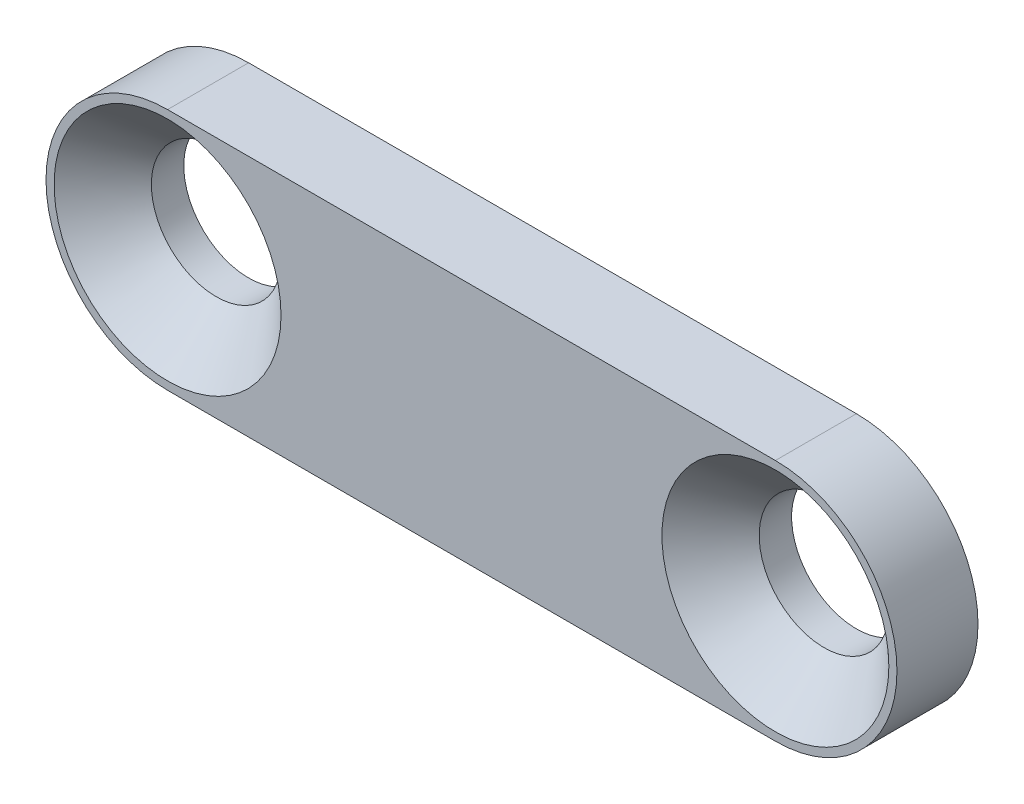
ISO-10303-21;
HEADER;
FILE_DESCRIPTION(('STEP AP214'),'2;1');
FILE_NAME('part.step','',(''),(''),'','','');
FILE_SCHEMA(('AUTOMOTIVE_DESIGN { 1 0 10303 214 1 1 1 1 }'));
ENDSEC;
DATA;
#1=APPLICATION_CONTEXT('core data for automotive mechanical design processes');
#2=APPLICATION_PROTOCOL_DEFINITION('international standard','automotive_design',2000,#1);
#3=PRODUCT_CONTEXT('',#1,'mechanical');
#4=PRODUCT('Part','Part','',(#3));
#5=PRODUCT_RELATED_PRODUCT_CATEGORY('part','',(#4));
#6=PRODUCT_DEFINITION_FORMATION('','',#4);
#7=PRODUCT_DEFINITION_CONTEXT('part definition',#1,'design');
#8=PRODUCT_DEFINITION('design','',#6,#7);
#9=PRODUCT_DEFINITION_SHAPE('','',#8);
#10=(LENGTH_UNIT() NAMED_UNIT(*) SI_UNIT(.MILLI.,.METRE.));
#11=(NAMED_UNIT(*) PLANE_ANGLE_UNIT() SI_UNIT($,.RADIAN.));
#12=(NAMED_UNIT(*) SI_UNIT($,.STERADIAN.) SOLID_ANGLE_UNIT());
#13=UNCERTAINTY_MEASURE_WITH_UNIT(LENGTH_MEASURE(1.E-05),#10,'distance_accuracy_value','');
#14=(GEOMETRIC_REPRESENTATION_CONTEXT(3) GLOBAL_UNCERTAINTY_ASSIGNED_CONTEXT((#13)) GLOBAL_UNIT_ASSIGNED_CONTEXT((#10,
#11,#12)) REPRESENTATION_CONTEXT('',''));
#15=CARTESIAN_POINT('',(0.,0.,0.));
#16=DIRECTION('',(0.,0.,1.));
#17=DIRECTION('',(1.,0.,0.));
#18=AXIS2_PLACEMENT_3D('',#15,#16,#17);
#19=CARTESIAN_POINT('',(0.,0.,2.));
#20=DIRECTION('',(0.,0.,-1.));
#21=DIRECTION('',(-1.,0.,0.));
#22=AXIS2_PLACEMENT_3D('',#19,#20,#21);
#23=CYLINDRICAL_SURFACE('',#22,3.);
#24=CARTESIAN_POINT('',(0.,0.,0.));
#25=DIRECTION('',(0.,0.,1.));
#26=DIRECTION('',(1.,0.,0.));
#27=AXIS2_PLACEMENT_3D('',#24,#25,#26);
#28=CIRCLE('',#27,3.);
#29=CARTESIAN_POINT('',(0.,-3.,0.));
#30=VERTEX_POINT('',#29);
#31=CARTESIAN_POINT('',(0.,3.,0.));
#32=VERTEX_POINT('',#31);
#33=EDGE_CURVE('E115',#30,#32,#28,.T.);
#34=ORIENTED_EDGE('',*,*,#33,.T.);
#35=DIRECTION('',(0.,0.,-1.));
#36=VECTOR('',#35,1.);
#37=CARTESIAN_POINT('',(0.,3.,2.));
#38=LINE('',#37,#36);
#39=CARTESIAN_POINT('',(0.,3.,2.));
#40=VERTEX_POINT('',#39);
#41=EDGE_CURVE('E103',#40,#32,#38,.T.);
#42=ORIENTED_EDGE('',*,*,#41,.F.);
#43=CARTESIAN_POINT('',(0.,0.,2.));
#44=DIRECTION('',(0.,0.,1.));
#45=DIRECTION('',(1.,0.,0.));
#46=AXIS2_PLACEMENT_3D('',#43,#44,#45);
#47=CIRCLE('',#46,3.);
#48=CARTESIAN_POINT('',(0.,-3.,2.));
#49=VERTEX_POINT('',#48);
#50=EDGE_CURVE('E100',#49,#40,#47,.T.);
#51=ORIENTED_EDGE('',*,*,#50,.F.);
#52=DIRECTION('',(0.,0.,-1.));
#53=VECTOR('',#52,1.);
#54=CARTESIAN_POINT('',(0.,-3.,2.));
#55=LINE('',#54,#53);
#56=EDGE_CURVE('E107',#49,#30,#55,.T.);
#57=ORIENTED_EDGE('',*,*,#56,.T.);
#58=EDGE_LOOP('',(#34,#42,#51,#57));
#59=FACE_BOUND('',#58,.T.);
#60=ADVANCED_FACE('F43',(#59),#23,.T.);
#61=CARTESIAN_POINT('',(0.,3.,2.));
#62=DIRECTION('',(0.,-1.,0.));
#63=DIRECTION('',(1.,0.,0.));
#64=AXIS2_PLACEMENT_3D('',#61,#62,#63);
#65=PLANE('',#64);
#66=DIRECTION('',(-1.,0.,0.));
#67=VECTOR('',#66,1.);
#68=CARTESIAN_POINT('',(0.,3.,0.));
#69=LINE('',#68,#67);
#70=CARTESIAN_POINT('',(-15.,3.,0.));
#71=VERTEX_POINT('',#70);
#72=EDGE_CURVE('E105',#32,#71,#69,.T.);
#73=ORIENTED_EDGE('',*,*,#72,.T.);
#74=DIRECTION('',(0.,0.,-1.));
#75=VECTOR('',#74,1.);
#76=CARTESIAN_POINT('',(-15.,3.,2.));
#77=LINE('',#76,#75);
#78=CARTESIAN_POINT('',(-15.,3.,2.));
#79=VERTEX_POINT('',#78);
#80=EDGE_CURVE('E99',#79,#71,#77,.T.);
#81=ORIENTED_EDGE('',*,*,#80,.F.);
#82=DIRECTION('',(-1.,0.,0.));
#83=VECTOR('',#82,1.);
#84=CARTESIAN_POINT('',(0.,3.,2.));
#85=LINE('',#84,#83);
#86=EDGE_CURVE('E95',#40,#79,#85,.T.);
#87=ORIENTED_EDGE('',*,*,#86,.F.);
#88=ORIENTED_EDGE('',*,*,#41,.T.);
#89=EDGE_LOOP('',(#73,#81,#87,#88));
#90=FACE_BOUND('',#89,.T.);
#91=ADVANCED_FACE('F101',(#90),#65,.F.);
#92=CARTESIAN_POINT('',(-15.,0.,2.));
#93=DIRECTION('',(0.,0.,-1.));
#94=DIRECTION('',(-1.,0.,0.));
#95=AXIS2_PLACEMENT_3D('',#92,#93,#94);
#96=CYLINDRICAL_SURFACE('',#95,3.);
#97=CARTESIAN_POINT('',(-15.,0.,0.));
#98=DIRECTION('',(0.,0.,1.));
#99=DIRECTION('',(1.,0.,0.));
#100=AXIS2_PLACEMENT_3D('',#97,#98,#99);
#101=CIRCLE('',#100,3.);
#102=CARTESIAN_POINT('',(-15.,-3.,0.));
#103=VERTEX_POINT('',#102);
#104=EDGE_CURVE('E76',#71,#103,#101,.T.);
#105=ORIENTED_EDGE('',*,*,#104,.T.);
#106=DIRECTION('',(0.,0.,-1.));
#107=VECTOR('',#106,1.);
#108=CARTESIAN_POINT('',(-15.,-3.,2.));
#109=LINE('',#108,#107);
#110=CARTESIAN_POINT('',(-15.,-3.,2.));
#111=VERTEX_POINT('',#110);
#112=EDGE_CURVE('E102',#111,#103,#109,.T.);
#113=ORIENTED_EDGE('',*,*,#112,.F.);
#114=CARTESIAN_POINT('',(-15.,0.,2.));
#115=DIRECTION('',(0.,0.,1.));
#116=DIRECTION('',(1.,0.,0.));
#117=AXIS2_PLACEMENT_3D('',#114,#115,#116);
#118=CIRCLE('',#117,3.);
#119=EDGE_CURVE('E92',#79,#111,#118,.T.);
#120=ORIENTED_EDGE('',*,*,#119,.F.);
#121=ORIENTED_EDGE('',*,*,#80,.T.);
#122=EDGE_LOOP('',(#105,#113,#120,#121));
#123=FACE_BOUND('',#122,.T.);
#124=ADVANCED_FACE('F106',(#123),#96,.T.);
#125=CARTESIAN_POINT('',(0.,-3.,2.));
#126=DIRECTION('',(0.,1.,0.));
#127=DIRECTION('',(-1.,0.,0.));
#128=AXIS2_PLACEMENT_3D('',#125,#126,#127);
#129=PLANE('',#128);
#130=DIRECTION('',(1.,0.,0.));
#131=VECTOR('',#130,1.);
#132=CARTESIAN_POINT('',(0.,-3.,0.));
#133=LINE('',#132,#131);
#134=EDGE_CURVE('E81',#103,#30,#133,.T.);
#135=ORIENTED_EDGE('',*,*,#134,.T.);
#136=ORIENTED_EDGE('',*,*,#56,.F.);
#137=DIRECTION('',(1.,0.,0.));
#138=VECTOR('',#137,1.);
#139=CARTESIAN_POINT('',(0.,-3.,2.));
#140=LINE('',#139,#138);
#141=EDGE_CURVE('E63',#111,#49,#140,.T.);
#142=ORIENTED_EDGE('',*,*,#141,.F.);
#143=ORIENTED_EDGE('',*,*,#112,.T.);
#144=EDGE_LOOP('',(#135,#136,#142,#143));
#145=FACE_BOUND('',#144,.T.);
#146=ADVANCED_FACE('F179',(#145),#129,.F.);
#147=CARTESIAN_POINT('',(0.,0.,2.));
#148=DIRECTION('',(0.,0.,1.));
#149=DIRECTION('',(1.,0.,0.));
#150=AXIS2_PLACEMENT_3D('',#147,#148,#149);
#151=PLANE('',#150);
#152=CARTESIAN_POINT('',(0.,0.,2.));
#153=DIRECTION('',(0.,0.,1.));
#154=DIRECTION('',(1.,0.,0.));
#155=AXIS2_PLACEMENT_3D('',#152,#153,#154);
#156=CIRCLE('',#155,2.8);
#157=CARTESIAN_POINT('',(2.8,0.,2.));
#158=VERTEX_POINT('',#157);
#159=EDGE_CURVE('E52',#158,#158,#156,.F.);
#160=ORIENTED_EDGE('',*,*,#159,.T.);
#161=EDGE_LOOP('',(#160));
#162=FACE_BOUND('',#161,.T.);
#163=CARTESIAN_POINT('',(-15.,0.,2.));
#164=DIRECTION('',(0.,0.,1.));
#165=DIRECTION('',(1.,0.,0.));
#166=AXIS2_PLACEMENT_3D('',#163,#164,#165);
#167=CIRCLE('',#166,2.80000000000001);
#168=CARTESIAN_POINT('',(-12.2,0.,2.));
#169=VERTEX_POINT('',#168);
#170=EDGE_CURVE('E123',#169,#169,#167,.F.);
#171=ORIENTED_EDGE('',*,*,#170,.T.);
#172=EDGE_LOOP('',(#171));
#173=FACE_BOUND('',#172,.T.);
#174=ORIENTED_EDGE('',*,*,#50,.T.);
#175=ORIENTED_EDGE('',*,*,#86,.T.);
#176=ORIENTED_EDGE('',*,*,#119,.T.);
#177=ORIENTED_EDGE('',*,*,#141,.T.);
#178=EDGE_LOOP('',(#174,#175,#176,#177));
#179=FACE_BOUND('',#178,.T.);
#180=ADVANCED_FACE('F91',(#162,#173,#179),#151,.T.);
#181=CARTESIAN_POINT('',(0.,0.,0.));
#182=DIRECTION('',(0.,0.,1.));
#183=DIRECTION('',(1.,0.,0.));
#184=AXIS2_PLACEMENT_3D('',#181,#182,#183);
#185=PLANE('',#184);
#186=CARTESIAN_POINT('',(0.,0.,0.));
#187=DIRECTION('',(0.,0.,1.));
#188=DIRECTION('',(1.,0.,0.));
#189=AXIS2_PLACEMENT_3D('',#186,#187,#188);
#190=CIRCLE('',#189,1.6);
#191=CARTESIAN_POINT('',(1.6,0.,0.));
#192=VERTEX_POINT('',#191);
#193=EDGE_CURVE('E113',#192,#192,#190,.T.);
#194=ORIENTED_EDGE('',*,*,#193,.T.);
#195=EDGE_LOOP('',(#194));
#196=FACE_BOUND('',#195,.T.);
#197=CARTESIAN_POINT('',(-15.,0.,0.));
#198=DIRECTION('',(0.,0.,1.));
#199=DIRECTION('',(1.,0.,0.));
#200=AXIS2_PLACEMENT_3D('',#197,#198,#199);
#201=CIRCLE('',#200,1.6);
#202=CARTESIAN_POINT('',(-13.4,0.,0.));
#203=VERTEX_POINT('',#202);
#204=EDGE_CURVE('E144',#203,#203,#201,.T.);
#205=ORIENTED_EDGE('',*,*,#204,.T.);
#206=EDGE_LOOP('',(#205));
#207=FACE_BOUND('',#206,.T.);
#208=ORIENTED_EDGE('',*,*,#33,.F.);
#209=ORIENTED_EDGE('',*,*,#134,.F.);
#210=ORIENTED_EDGE('',*,*,#104,.F.);
#211=ORIENTED_EDGE('',*,*,#72,.F.);
#212=EDGE_LOOP('',(#208,#209,#210,#211));
#213=FACE_BOUND('',#212,.T.);
#214=ADVANCED_FACE('F151',(#196,#207,#213),#185,.F.);
#215=CARTESIAN_POINT('',(-15.,0.,0.));
#216=DIRECTION('',(0.,0.,1.));
#217=DIRECTION('',(1.,0.,0.));
#218=AXIS2_PLACEMENT_3D('',#215,#216,#217);
#219=CYLINDRICAL_SURFACE('',#218,1.6);
#220=CARTESIAN_POINT('',(-15.,0.,0.800000000000001));
#221=DIRECTION('',(0.,0.,1.));
#222=DIRECTION('',(1.,0.,0.));
#223=AXIS2_PLACEMENT_3D('',#220,#221,#222);
#224=CIRCLE('',#223,1.6);
#225=CARTESIAN_POINT('',(-13.4,0.,0.800000000000001));
#226=VERTEX_POINT('',#225);
#227=EDGE_CURVE('E11',#226,#226,#224,.T.);
#228=ORIENTED_EDGE('',*,*,#227,.T.);
#229=EDGE_LOOP('',(#228));
#230=FACE_BOUND('',#229,.T.);
#231=ORIENTED_EDGE('',*,*,#204,.F.);
#232=EDGE_LOOP('',(#231));
#233=FACE_BOUND('',#232,.T.);
#234=ADVANCED_FACE('F138',(#230,#233),#219,.F.);
#235=CARTESIAN_POINT('',(0.,0.,0.));
#236=DIRECTION('',(0.,0.,1.));
#237=DIRECTION('',(1.,0.,0.));
#238=AXIS2_PLACEMENT_3D('',#235,#236,#237);
#239=CYLINDRICAL_SURFACE('',#238,1.6);
#240=CARTESIAN_POINT('',(0.,0.,0.800000000000002));
#241=DIRECTION('',(0.,0.,1.));
#242=DIRECTION('',(1.,0.,0.));
#243=AXIS2_PLACEMENT_3D('',#240,#241,#242);
#244=CIRCLE('',#243,1.6);
#245=CARTESIAN_POINT('',(1.6,0.,0.800000000000002));
#246=VERTEX_POINT('',#245);
#247=EDGE_CURVE('E125',#246,#246,#244,.T.);
#248=ORIENTED_EDGE('',*,*,#247,.T.);
#249=EDGE_LOOP('',(#248));
#250=FACE_BOUND('',#249,.T.);
#251=ORIENTED_EDGE('',*,*,#193,.F.);
#252=EDGE_LOOP('',(#251));
#253=FACE_BOUND('',#252,.T.);
#254=ADVANCED_FACE('F134',(#250,#253),#239,.F.);
#255=CARTESIAN_POINT('',(0.,0.,0.800000000000002));
#256=DIRECTION('',(0.,0.,1.));
#257=DIRECTION('',(1.,0.,0.));
#258=AXIS2_PLACEMENT_3D('',#255,#256,#257);
#259=CONICAL_SURFACE('',#258,1.6,0.785398163397451);
#260=ORIENTED_EDGE('',*,*,#159,.F.);
#261=EDGE_LOOP('',(#260));
#262=FACE_BOUND('',#261,.T.);
#263=ORIENTED_EDGE('',*,*,#247,.F.);
#264=EDGE_LOOP('',(#263));
#265=FACE_BOUND('',#264,.T.);
#266=ADVANCED_FACE('F135',(#262,#265),#259,.F.);
#267=CARTESIAN_POINT('',(-15.,0.,0.800000000000001));
#268=DIRECTION('',(0.,0.,1.));
#269=DIRECTION('',(1.,0.,0.));
#270=AXIS2_PLACEMENT_3D('',#267,#268,#269);
#271=CONICAL_SURFACE('',#270,1.6,0.785398163397451);
#272=ORIENTED_EDGE('',*,*,#170,.F.);
#273=EDGE_LOOP('',(#272));
#274=FACE_BOUND('',#273,.T.);
#275=ORIENTED_EDGE('',*,*,#227,.F.);
#276=EDGE_LOOP('',(#275));
#277=FACE_BOUND('',#276,.T.);
#278=ADVANCED_FACE('F46',(#274,#277),#271,.F.);
#279=CLOSED_SHELL('',(#60,#91,#124,#146,#180,#214,#234,#254,#266,#278));
#280=MANIFOLD_SOLID_BREP('B2',#279);
#281=ADVANCED_BREP_SHAPE_REPRESENTATION('',(#18,#280),#14);
#282=SHAPE_DEFINITION_REPRESENTATION(#9,#281);
ENDSEC;
END-ISO-10303-21;
